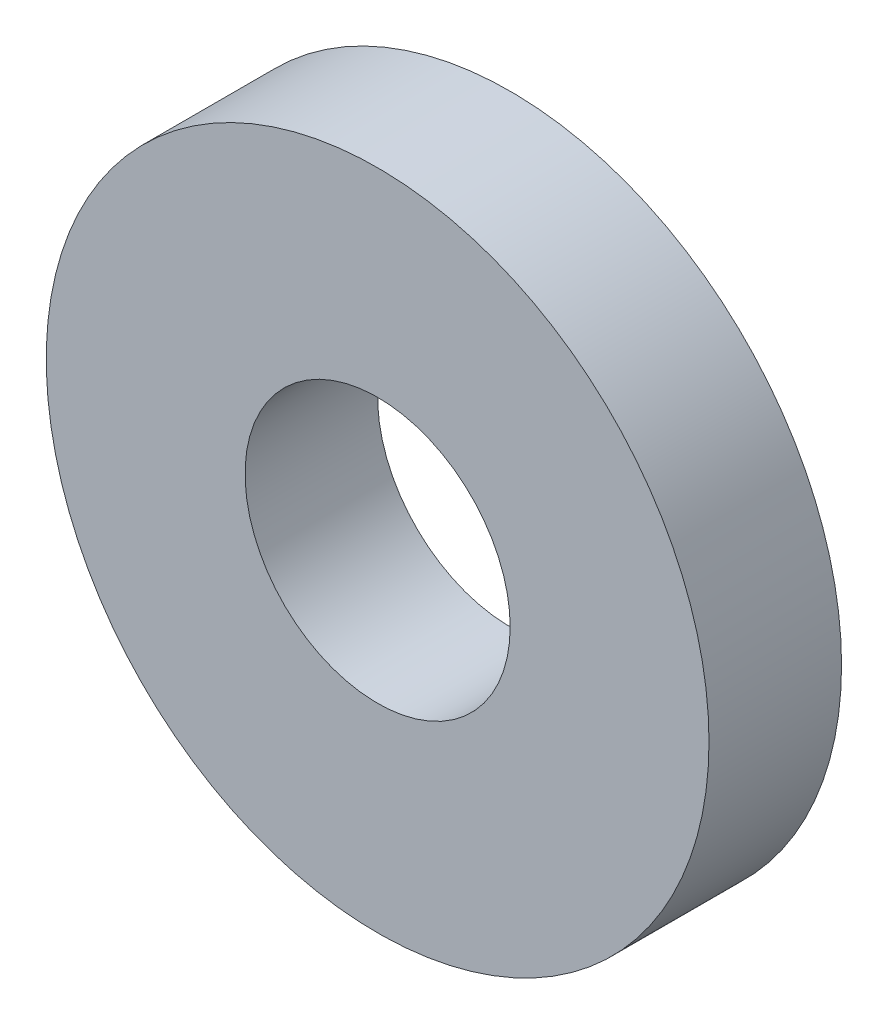
ISO-10303-21;
HEADER;
FILE_DESCRIPTION(('STEP AP214'),'2;1');
FILE_NAME('part.step','',(''),(''),'','','');
FILE_SCHEMA(('AUTOMOTIVE_DESIGN { 1 0 10303 214 1 1 1 1 }'));
ENDSEC;
DATA;
#1=APPLICATION_CONTEXT('core data for automotive mechanical design processes');
#2=APPLICATION_PROTOCOL_DEFINITION('international standard','automotive_design',2000,#1);
#3=PRODUCT_CONTEXT('',#1,'mechanical');
#4=PRODUCT('Part','Part','',(#3));
#5=PRODUCT_RELATED_PRODUCT_CATEGORY('part','',(#4));
#6=PRODUCT_DEFINITION_FORMATION('','',#4);
#7=PRODUCT_DEFINITION_CONTEXT('part definition',#1,'design');
#8=PRODUCT_DEFINITION('design','',#6,#7);
#9=PRODUCT_DEFINITION_SHAPE('','',#8);
#10=(LENGTH_UNIT() NAMED_UNIT(*) SI_UNIT(.MILLI.,.METRE.));
#11=(NAMED_UNIT(*) PLANE_ANGLE_UNIT() SI_UNIT($,.RADIAN.));
#12=(NAMED_UNIT(*) SI_UNIT($,.STERADIAN.) SOLID_ANGLE_UNIT());
#13=UNCERTAINTY_MEASURE_WITH_UNIT(LENGTH_MEASURE(1.E-05),#10,'distance_accuracy_value','');
#14=(GEOMETRIC_REPRESENTATION_CONTEXT(3) GLOBAL_UNCERTAINTY_ASSIGNED_CONTEXT((#13)) GLOBAL_UNIT_ASSIGNED_CONTEXT((#10,
#11,#12)) REPRESENTATION_CONTEXT('',''));
#15=CARTESIAN_POINT('',(0.,0.,0.));
#16=DIRECTION('',(0.,0.,1.));
#17=DIRECTION('',(1.,0.,0.));
#18=AXIS2_PLACEMENT_3D('',#15,#16,#17);
#19=CARTESIAN_POINT('',(0.,0.,1.));
#20=DIRECTION('',(0.,0.,1.));
#21=DIRECTION('',(1.,0.,0.));
#22=AXIS2_PLACEMENT_3D('',#19,#20,#21);
#23=PLANE('',#22);
#24=CARTESIAN_POINT('',(0.,0.,1.));
#25=DIRECTION('',(0.,0.,1.));
#26=DIRECTION('',(1.,0.,0.));
#27=AXIS2_PLACEMENT_3D('',#24,#25,#26);
#28=CIRCLE('',#27,2.5);
#29=CARTESIAN_POINT('',(2.5,0.,1.));
#30=VERTEX_POINT('',#29);
#31=EDGE_CURVE('E10',#30,#30,#28,.T.);
#32=ORIENTED_EDGE('',*,*,#31,.T.);
#33=EDGE_LOOP('',(#32));
#34=FACE_BOUND('',#33,.T.);
#35=CARTESIAN_POINT('',(0.,0.,1.));
#36=DIRECTION('',(0.,0.,1.));
#37=DIRECTION('',(1.,0.,0.));
#38=AXIS2_PLACEMENT_3D('',#35,#36,#37);
#39=CIRCLE('',#38,1.);
#40=CARTESIAN_POINT('',(1.,0.,1.));
#41=VERTEX_POINT('',#40);
#42=EDGE_CURVE('E46',#41,#41,#39,.T.);
#43=ORIENTED_EDGE('',*,*,#42,.F.);
#44=EDGE_LOOP('',(#43));
#45=FACE_BOUND('',#44,.T.);
#46=ADVANCED_FACE('F35',(#34,#45),#23,.T.);
#47=CARTESIAN_POINT('',(0.,0.,0.));
#48=DIRECTION('',(0.,0.,1.));
#49=DIRECTION('',(1.,0.,0.));
#50=AXIS2_PLACEMENT_3D('',#47,#48,#49);
#51=PLANE('',#50);
#52=CARTESIAN_POINT('',(0.,0.,0.));
#53=DIRECTION('',(0.,0.,1.));
#54=DIRECTION('',(1.,0.,0.));
#55=AXIS2_PLACEMENT_3D('',#52,#53,#54);
#56=CIRCLE('',#55,2.5);
#57=CARTESIAN_POINT('',(2.5,0.,0.));
#58=VERTEX_POINT('',#57);
#59=EDGE_CURVE('E39',#58,#58,#56,.T.);
#60=ORIENTED_EDGE('',*,*,#59,.F.);
#61=EDGE_LOOP('',(#60));
#62=FACE_BOUND('',#61,.T.);
#63=CARTESIAN_POINT('',(0.,0.,0.));
#64=DIRECTION('',(0.,0.,1.));
#65=DIRECTION('',(1.,0.,0.));
#66=AXIS2_PLACEMENT_3D('',#63,#64,#65);
#67=CIRCLE('',#66,1.);
#68=CARTESIAN_POINT('',(1.,0.,0.));
#69=VERTEX_POINT('',#68);
#70=EDGE_CURVE('E48',#69,#69,#67,.T.);
#71=ORIENTED_EDGE('',*,*,#70,.T.);
#72=EDGE_LOOP('',(#71));
#73=FACE_BOUND('',#72,.T.);
#74=ADVANCED_FACE('F58',(#62,#73),#51,.F.);
#75=CARTESIAN_POINT('',(0.,0.,1.));
#76=DIRECTION('',(0.,0.,-1.));
#77=DIRECTION('',(-1.,0.,0.));
#78=AXIS2_PLACEMENT_3D('',#75,#76,#77);
#79=CYLINDRICAL_SURFACE('',#78,2.5);
#80=ORIENTED_EDGE('',*,*,#31,.F.);
#81=EDGE_LOOP('',(#80));
#82=FACE_BOUND('',#81,.T.);
#83=ORIENTED_EDGE('',*,*,#59,.T.);
#84=EDGE_LOOP('',(#83));
#85=FACE_BOUND('',#84,.T.);
#86=ADVANCED_FACE('F37',(#82,#85),#79,.T.);
#87=CARTESIAN_POINT('',(0.,0.,1.));
#88=DIRECTION('',(0.,0.,-1.));
#89=DIRECTION('',(-1.,0.,0.));
#90=AXIS2_PLACEMENT_3D('',#87,#88,#89);
#91=CYLINDRICAL_SURFACE('',#90,1.);
#92=ORIENTED_EDGE('',*,*,#42,.T.);
#93=EDGE_LOOP('',(#92));
#94=FACE_BOUND('',#93,.T.);
#95=ORIENTED_EDGE('',*,*,#70,.F.);
#96=EDGE_LOOP('',(#95));
#97=FACE_BOUND('',#96,.T.);
#98=ADVANCED_FACE('F54',(#94,#97),#91,.F.);
#99=CLOSED_SHELL('',(#46,#74,#86,#98));
#100=MANIFOLD_SOLID_BREP('B2',#99);
#101=ADVANCED_BREP_SHAPE_REPRESENTATION('',(#18,#100),#14);
#102=SHAPE_DEFINITION_REPRESENTATION(#9,#101);
ENDSEC;
END-ISO-10303-21;
